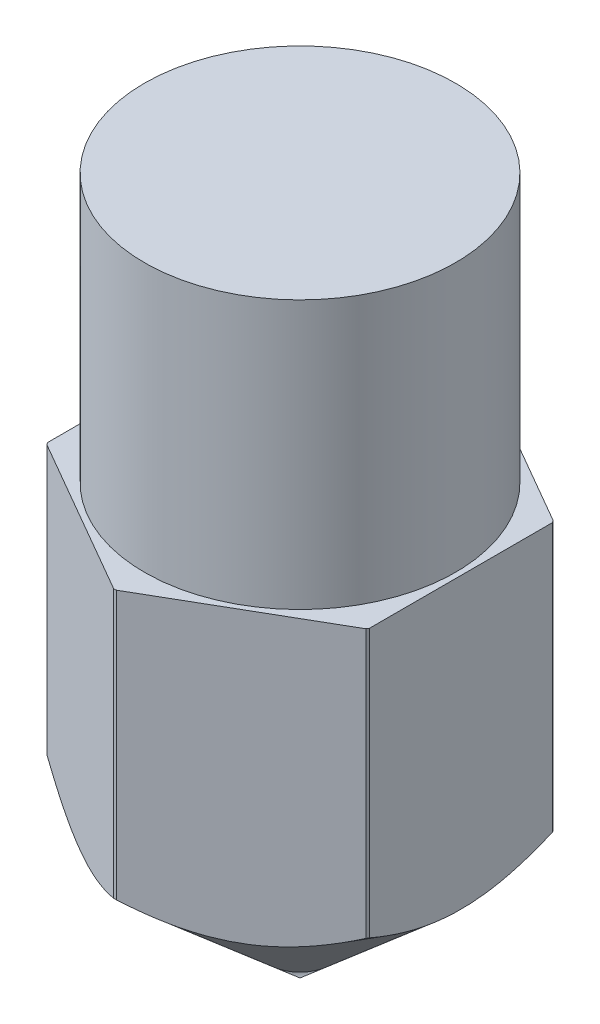
ISO-10303-21;
HEADER;
FILE_DESCRIPTION(('STEP AP214'),'2;1');
FILE_NAME('part.step','',(''),(''),'','','');
FILE_SCHEMA(('AUTOMOTIVE_DESIGN { 1 0 10303 214 1 1 1 1 }'));
ENDSEC;
DATA;
#1=APPLICATION_CONTEXT('core data for automotive mechanical design processes');
#2=APPLICATION_PROTOCOL_DEFINITION('international standard','automotive_design',2000,#1);
#3=PRODUCT_CONTEXT('',#1,'mechanical');
#4=PRODUCT('Part','Part','',(#3));
#5=PRODUCT_RELATED_PRODUCT_CATEGORY('part','',(#4));
#6=PRODUCT_DEFINITION_FORMATION('','',#4);
#7=PRODUCT_DEFINITION_CONTEXT('part definition',#1,'design');
#8=PRODUCT_DEFINITION('design','',#6,#7);
#9=PRODUCT_DEFINITION_SHAPE('','',#8);
#10=(LENGTH_UNIT() NAMED_UNIT(*) SI_UNIT(.MILLI.,.METRE.));
#11=(NAMED_UNIT(*) PLANE_ANGLE_UNIT() SI_UNIT($,.RADIAN.));
#12=(NAMED_UNIT(*) SI_UNIT($,.STERADIAN.) SOLID_ANGLE_UNIT());
#13=UNCERTAINTY_MEASURE_WITH_UNIT(LENGTH_MEASURE(1.E-05),#10,'distance_accuracy_value','');
#14=(GEOMETRIC_REPRESENTATION_CONTEXT(3) GLOBAL_UNCERTAINTY_ASSIGNED_CONTEXT((#13)) GLOBAL_UNIT_ASSIGNED_CONTEXT((#10,
#11,#12)) REPRESENTATION_CONTEXT('',''));
#15=CARTESIAN_POINT('',(0.,0.,0.));
#16=DIRECTION('',(0.,0.,1.));
#17=DIRECTION('',(1.,0.,0.));
#18=AXIS2_PLACEMENT_3D('',#15,#16,#17);
#19=CARTESIAN_POINT('',(0.,-13.,0.));
#20=DIRECTION('',(0.,1.,0.));
#21=DIRECTION('',(-1.,0.,0.));
#22=AXIS2_PLACEMENT_3D('',#19,#20,#21);
#23=CONICAL_SURFACE('',#22,0.,0.855052737126017);
#24=CARTESIAN_POINT('',(0.,-13.,0.));
#25=VERTEX_POINT('',#24);
#26=VERTEX_LOOP('',#25);
#27=FACE_BOUND('',#26,.T.);
#28=CARTESIAN_POINT('',(2.97582698500776,-9.99979999999965,-1.74600710428177));
#29=CARTESIAN_POINT('',(2.8606843641568,-10.056873003555,-1.81248472742527));
#30=CARTESIAN_POINT('',(2.74377777784905,-10.1098350378683,-1.87998077650009));
#31=CARTESIAN_POINT('',(2.50603433844776,-10.2047196229342,-2.0172420152365));
#32=CARTESIAN_POINT('',(2.38518081891569,-10.2465859126824,-2.08701682727085));
#33=CARTESIAN_POINT('',(2.14240753319206,-10.315233555168,-2.22718204913544));
#34=CARTESIAN_POINT('',(2.02054230392454,-10.3422631407693,-2.2975409720579));
#35=CARTESIAN_POINT('',(1.77510943904683,-10.3795345895943,-2.43924170266302));
#36=CARTESIAN_POINT('',(1.65154617808734,-10.3898135490278,-2.51058098463993));
#37=CARTESIAN_POINT('',(1.42065834771779,-10.3923164897,-2.6438841356564));
#38=CARTESIAN_POINT('',(1.31334848159069,-10.3867495257824,-2.70583951575159));
#39=CARTESIAN_POINT('',(1.09976337333825,-10.362685630033,-2.82915293549603));
#40=CARTESIAN_POINT('',(0.993488968299226,-10.3441789956812,-2.89051049185327));
#41=CARTESIAN_POINT('',(0.782937263145666,-10.2957306481262,-3.01207257550202));
#42=CARTESIAN_POINT('',(0.678660435504027,-10.2657862638618,-3.07227683001116));
#43=CARTESIAN_POINT('',(0.472569218996037,-10.1964233676908,-3.19126364933966));
#44=CARTESIAN_POINT('',(0.370754048546885,-10.1570079075343,-3.25004666540607));
#45=CARTESIAN_POINT('',(0.228722192747571,-10.0959918395221,-3.3320487955853));
#46=CARTESIAN_POINT('',(0.187465297515393,-10.0775328166429,-3.35586847515353));
#47=CARTESIAN_POINT('',(0.105465966879054,-10.0394898179468,-3.40321081076979));
#48=CARTESIAN_POINT('',(0.0647224759850853,-10.019908878748,-3.42673407620515));
#49=CARTESIAN_POINT('',(0.0241730149929438,-9.9998,-3.45014531842446));
#50=B_SPLINE_CURVE_WITH_KNOTS('',3,(#28,#29,#30,#31,#32,#33,#34,#35,#36,#37,#38,#39,#40,#41,#42,
#43,#44,#45,#46,#47,#48,#49),.UNSPECIFIED.,.F.,.F.,(4,2,2,2,2,2,2,2,2,2,4),(0.,
0.434373091967146,0.870908269006301,1.29989799407539,1.72793637399438,2.09933699078706,
2.47101639303157,2.84278264680593,3.21442927110194,3.36769023684121,3.52055436152839),.UNSPECIFIED.);
#51=CARTESIAN_POINT('',(2.97542366796795,-10.,-1.74623995948327));
#52=VERTEX_POINT('',#51);
#53=CARTESIAN_POINT('',(0.0245763320320507,-10.,-3.44991246322336));
#54=VERTEX_POINT('',#53);
#55=EDGE_CURVE('E258',#52,#54,#50,.T.);
#56=ORIENTED_EDGE('',*,*,#55,.F.);
#57=CARTESIAN_POINT('',(0.,-10.,0.));
#58=DIRECTION('',(0.,1.,0.));
#59=DIRECTION('',(-1.,0.,0.));
#60=AXIS2_PLACEMENT_3D('',#57,#58,#59);
#61=CIRCLE('',#60,3.45);
#62=CARTESIAN_POINT('',(3.,-10.,-1.70367250374008));
#63=VERTEX_POINT('',#62);
#64=EDGE_CURVE('E262',#63,#52,#61,.T.);
#65=ORIENTED_EDGE('',*,*,#64,.F.);
#66=CARTESIAN_POINT('',(3.,-8.50880616450568,-4.20427308638562));
#67=CARTESIAN_POINT('',(3.,-8.58794816038584,-4.09243355266203));
#68=CARTESIAN_POINT('',(3.,-8.6664126221812,-3.9801060073593));
#69=CARTESIAN_POINT('',(3.,-8.82161955852323,-3.75422531263634));
#70=CARTESIAN_POINT('',(3.,-8.89836157417197,-3.64067184826285));
#71=CARTESIAN_POINT('',(3.,-9.05050693096265,-3.41095210226605));
#72=CARTESIAN_POINT('',(3.,-9.12588784410657,-3.29477091231523));
#73=CARTESIAN_POINT('',(3.,-9.27390458079382,-3.06068129290418));
#74=CARTESIAN_POINT('',(3.,-9.34654064278752,-2.94277301471989));
#75=CARTESIAN_POINT('',(3.,-9.49305636351739,-2.69694529878853));
#76=CARTESIAN_POINT('',(3.,-9.56669648277142,-2.56888222960662));
#77=CARTESIAN_POINT('',(3.,-9.70880199247375,-2.30984944012048));
#78=CARTESIAN_POINT('',(3.,-9.77726603511995,-2.1788789741635));
#79=CARTESIAN_POINT('',(3.,-9.90700995383824,-1.9140868476562));
#80=CARTESIAN_POINT('',(3.,-9.96831930509321,-1.78027977801205));
#81=CARTESIAN_POINT('',(3.,-10.0817631955177,-1.50887025069402));
#82=CARTESIAN_POINT('',(3.,-10.1339043747502,-1.37127062403263));
#83=CARTESIAN_POINT('',(3.,-10.2167201540331,-1.12049072150806));
#84=CARTESIAN_POINT('',(3.,-10.2496039775731,-1.00804734477717));
#85=CARTESIAN_POINT('',(3.,-10.306060206676,-0.780792520425109));
#86=CARTESIAN_POINT('',(3.,-10.329631973577,-0.665980910948103));
#87=CARTESIAN_POINT('',(3.,-10.3655779167841,-0.436838575415079));
#88=CARTESIAN_POINT('',(3.,-10.3781579320622,-0.322540763241441));
#89=CARTESIAN_POINT('',(3.,-10.3919377853524,-0.0932550672200131));
#90=CARTESIAN_POINT('',(3.,-10.3931388810173,0.0217327389605881));
#91=CARTESIAN_POINT('',(3.,-10.3843322311068,0.244678229057442));
#92=CARTESIAN_POINT('',(3.,-10.3749611547034,0.352662116434098));
#93=CARTESIAN_POINT('',(3.,-10.3466654374196,0.567376562358199));
#94=CARTESIAN_POINT('',(3.,-10.327738291009,0.674106784690343));
#95=CARTESIAN_POINT('',(3.,-10.2810049098009,0.887727505782129));
#96=CARTESIAN_POINT('',(3.,-10.2530349046591,0.994581606673847));
#97=CARTESIAN_POINT('',(3.,-10.1897227806305,1.20602990112995));
#98=CARTESIAN_POINT('',(3.,-10.1543817657773,1.31062443054789));
#99=CARTESIAN_POINT('',(3.,-10.059059233376,1.56774748787341));
#100=CARTESIAN_POINT('',(3.,-9.99544029275498,1.71892003226438));
#101=CARTESIAN_POINT('',(3.,-9.85851286564258,2.0168492192344));
#102=CARTESIAN_POINT('',(3.,-9.78519703958335,2.16360241247353));
#103=CARTESIAN_POINT('',(3.,-9.63121634208498,2.45396491475403));
#104=CARTESIAN_POINT('',(3.,-9.55052159569878,2.59755823390073));
#105=CARTESIAN_POINT('',(3.,-9.38394910977586,2.88162544871116));
#106=CARTESIAN_POINT('',(3.,-9.2980728638558,3.02210022750289));
#107=CARTESIAN_POINT('',(3.,-9.12898040255865,3.29017325484228));
#108=CARTESIAN_POINT('',(3.,-9.04604475534989,3.41794945826054));
#109=CARTESIAN_POINT('',(3.,-8.87756022368648,3.67177811184209));
#110=CARTESIAN_POINT('',(3.,-8.79201111193149,3.79783041068443));
#111=CARTESIAN_POINT('',(3.,-8.61970920435081,4.04727506438435));
#112=CARTESIAN_POINT('',(3.,-8.53297656936191,4.1706813900474));
#113=CARTESIAN_POINT('',(3.,-8.35788908863911,4.41629680008578));
#114=CARTESIAN_POINT('',(3.,-8.26953461553244,4.53850614981828));
#115=CARTESIAN_POINT('',(3.,-8.18054644696871,4.66024492887926));
#116=B_SPLINE_CURVE_WITH_KNOTS('',3,(#66,#67,#68,#69,#70,#71,#72,#73,#74,#75,#76,#77,#78,#79,
#80,#81,#82,#83,#84,#85,#86,#87,#88,#89,#90,#91,#92,#93,#94,#95,#96,#97,#98,#99,#100,#101,#102,
#103,#104,#105,#106,#107,#108,#109,#110,#111,#112,#113,#114,#115),.UNSPECIFIED.,.F.,.F.,(4,2,2,
2,2,2,2,2,2,2,2,2,2,2,2,2,2,2,2,2,2,2,2,2,4),(0.,0.411035638192859,0.822179515821306,
1.23762800663316,1.6530403232949,2.09612803666764,2.5393307313906,2.98063778796532,
3.42162389878687,3.77275877806019,4.12391773553547,4.46835031358562,4.81274482284936,
5.13745697374082,5.46225430597881,5.79329847111396,6.1242930878484,6.61582457465689,
7.10773025355811,7.60172402836889,8.09557607883956,8.55253372629521,9.0095312304211,
9.46202661947464,9.91441931491114),.UNSPECIFIED.);
#117=CARTESIAN_POINT('',(3.,-10.,1.70367250374009));
#118=VERTEX_POINT('',#117);
#119=EDGE_CURVE('E305',#118,#63,#116,.F.);
#120=ORIENTED_EDGE('',*,*,#119,.F.);
#121=CARTESIAN_POINT('',(2.97542366796795,-10.,1.74623995948327));
#122=VERTEX_POINT('',#121);
#123=EDGE_CURVE('E181',#122,#118,#61,.T.);
#124=ORIENTED_EDGE('',*,*,#123,.F.);
#125=CARTESIAN_POINT('',(0.0241730149929436,-9.9998,3.45014531842445));
#126=CARTESIAN_POINT('',(0.139315635843858,-10.0568730035553,3.38366769528098));
#127=CARTESIAN_POINT('',(0.256222222151568,-10.1098350378686,3.31617164620618));
#128=CARTESIAN_POINT('',(0.493965661552768,-10.2047196229344,3.17891040746983));
#129=CARTESIAN_POINT('',(0.614819181084786,-10.2465859126826,3.10913559543551));
#130=CARTESIAN_POINT('',(0.85759246680832,-10.3152335551681,2.96897037357098));
#131=CARTESIAN_POINT('',(0.979457696075798,-10.3422631407694,2.89861145064854));
#132=CARTESIAN_POINT('',(1.2248905609534,-10.3795345895944,2.75691072004348));
#133=CARTESIAN_POINT('',(1.34845382191284,-10.3898135490278,2.6855714380666));
#134=CARTESIAN_POINT('',(1.57934165228231,-10.3923164897,2.55226828705017));
#135=CARTESIAN_POINT('',(1.68665151840939,-10.3867495257824,2.490312906955));
#136=CARTESIAN_POINT('',(1.90023662666178,-10.362685630033,2.36699948721059));
#137=CARTESIAN_POINT('',(2.00651103170078,-10.3441789956812,2.30564193085335));
#138=CARTESIAN_POINT('',(2.2170627368543,-10.2957306481263,2.18407984720464));
#139=CARTESIAN_POINT('',(2.32133956449591,-10.2657862638618,2.12387559269551));
#140=CARTESIAN_POINT('',(2.52743078100386,-10.1964233676908,2.00488877336703));
#141=CARTESIAN_POINT('',(2.62924595145299,-10.1570079075344,1.94610575730064));
#142=CARTESIAN_POINT('',(2.77127780725243,-10.0959918395221,1.86410362712133));
#143=CARTESIAN_POINT('',(2.81253470248475,-10.0775328166429,1.84028394755302));
#144=CARTESIAN_POINT('',(2.89453403312137,-10.0394898179466,1.7929416119366));
#145=CARTESIAN_POINT('',(2.93527752401548,-10.0199088787478,1.76941834650116));
#146=CARTESIAN_POINT('',(2.97582698500776,-9.99979999999966,1.74600710428177));
#147=B_SPLINE_CURVE_WITH_KNOTS('',3,(#125,#126,#127,#128,#129,#130,#131,#132,#133,#134,#135,
#136,#137,#138,#139,#140,#141,#142,#143,#144,#145,#146),.UNSPECIFIED.,.F.,.F.,(4,2,2,2,2,2,2,2,
2,2,4),(0.,0.434373091966962,0.870908269005932,1.29989799407484,1.72793637399365,
2.09933699078625,2.47101639303067,2.84278264680495,3.21442927110089,3.36769023684069,
3.52055436152839),.UNSPECIFIED.);
#148=CARTESIAN_POINT('',(0.0245763320320489,-10.,3.44991246322336));
#149=VERTEX_POINT('',#148);
#150=EDGE_CURVE('E182',#149,#122,#147,.T.);
#151=ORIENTED_EDGE('',*,*,#150,.F.);
#152=CARTESIAN_POINT('',(-0.0245763320320482,-10.,3.44991246322336));
#153=VERTEX_POINT('',#152);
#154=EDGE_CURVE('E196',#153,#149,#61,.T.);
#155=ORIENTED_EDGE('',*,*,#154,.F.);
#156=CARTESIAN_POINT('',(-2.97582698500776,-9.99979999999965,1.74600710428177));
#157=CARTESIAN_POINT('',(-2.8606843641568,-10.056873003555,1.81248472742527));
#158=CARTESIAN_POINT('',(-2.74377777784905,-10.1098350378683,1.87998077650009));
#159=CARTESIAN_POINT('',(-2.50603433844776,-10.2047196229342,2.0172420152365));
#160=CARTESIAN_POINT('',(-2.38518081891569,-10.2465859126824,2.08701682727085));
#161=CARTESIAN_POINT('',(-2.14240753319206,-10.315233555168,2.22718204913543));
#162=CARTESIAN_POINT('',(-2.02054230392453,-10.3422631407693,2.2975409720579));
#163=CARTESIAN_POINT('',(-1.77510943904683,-10.3795345895943,2.43924170266302));
#164=CARTESIAN_POINT('',(-1.65154617808734,-10.3898135490278,2.51058098463993));
#165=CARTESIAN_POINT('',(-1.42065834771779,-10.3923164897,2.6438841356564));
#166=CARTESIAN_POINT('',(-1.31334848159068,-10.3867495257824,2.70583951575159));
#167=CARTESIAN_POINT('',(-1.09976337333825,-10.362685630033,2.82915293549603));
#168=CARTESIAN_POINT('',(-0.993488968299221,-10.3441789956812,2.89051049185327));
#169=CARTESIAN_POINT('',(-0.782937263145661,-10.2957306481262,3.01207257550202));
#170=CARTESIAN_POINT('',(-0.678660435504023,-10.2657862638618,3.07227683001116));
#171=CARTESIAN_POINT('',(-0.472569218996033,-10.1964233676908,3.19126364933966));
#172=CARTESIAN_POINT('',(-0.370754048546881,-10.1570079075343,3.25004666540607));
#173=CARTESIAN_POINT('',(-0.228722192747567,-10.0959918395221,3.3320487955853));
#174=CARTESIAN_POINT('',(-0.187465297515389,-10.0775328166429,3.35586847515353));
#175=CARTESIAN_POINT('',(-0.10546596687905,-10.0394898179468,3.40321081076979));
#176=CARTESIAN_POINT('',(-0.0647224759850819,-10.019908878748,3.42673407620515));
#177=CARTESIAN_POINT('',(-0.0241730149929401,-9.9998,3.45014531842446));
#178=B_SPLINE_CURVE_WITH_KNOTS('',3,(#156,#157,#158,#159,#160,#161,#162,#163,#164,#165,#166,
#167,#168,#169,#170,#171,#172,#173,#174,#175,#176,#177),.UNSPECIFIED.,.F.,.F.,(4,2,2,2,2,2,2,2,
2,2,4),(0.,0.434373091967145,0.8709082690063,1.29989799407539,1.72793637399438,2.09933699078707,
2.47101639303157,2.84278264680594,3.21442927110194,3.36769023684121,3.52055436152839),.UNSPECIFIED.);
#179=CARTESIAN_POINT('',(-2.97542366796795,-10.,1.74623995948327));
#180=VERTEX_POINT('',#179);
#181=EDGE_CURVE('E200',#180,#153,#178,.T.);
#182=ORIENTED_EDGE('',*,*,#181,.F.);
#183=CARTESIAN_POINT('',(-3.,-10.,1.70367250374008));
#184=VERTEX_POINT('',#183);
#185=EDGE_CURVE('E149',#184,#180,#61,.T.);
#186=ORIENTED_EDGE('',*,*,#185,.F.);
#187=CARTESIAN_POINT('',(-3.,-8.50880616450569,-4.20427308638561));
#188=CARTESIAN_POINT('',(-3.,-8.58794816038584,-4.09243355266203));
#189=CARTESIAN_POINT('',(-3.,-8.6664126221812,-3.98010600735929));
#190=CARTESIAN_POINT('',(-3.,-8.82161955852324,-3.75422531263634));
#191=CARTESIAN_POINT('',(-3.,-8.89836157417198,-3.64067184826285));
#192=CARTESIAN_POINT('',(-3.,-9.05050693096265,-3.41095210226605));
#193=CARTESIAN_POINT('',(-3.,-9.12588784410658,-3.29477091231523));
#194=CARTESIAN_POINT('',(-3.,-9.27390458079382,-3.06068129290417));
#195=CARTESIAN_POINT('',(-3.,-9.34654064278752,-2.94277301471989));
#196=CARTESIAN_POINT('',(-3.,-9.4930563635174,-2.69694529878853));
#197=CARTESIAN_POINT('',(-3.,-9.56669648277142,-2.56888222960662));
#198=CARTESIAN_POINT('',(-3.,-9.70880199247375,-2.30984944012047));
#199=CARTESIAN_POINT('',(-3.,-9.77726603511995,-2.1788789741635));
#200=CARTESIAN_POINT('',(-3.,-9.90700995383824,-1.9140868476562));
#201=CARTESIAN_POINT('',(-3.,-9.96831930509321,-1.78027977801205));
#202=CARTESIAN_POINT('',(-3.,-10.0817631955177,-1.50887025069402));
#203=CARTESIAN_POINT('',(-3.,-10.1339043747502,-1.37127062403263));
#204=CARTESIAN_POINT('',(-3.,-10.2167201540331,-1.12049072150806));
#205=CARTESIAN_POINT('',(-3.,-10.2496039775731,-1.00804734477717));
#206=CARTESIAN_POINT('',(-3.,-10.306060206676,-0.78079252042511));
#207=CARTESIAN_POINT('',(-3.,-10.329631973577,-0.665980910948104));
#208=CARTESIAN_POINT('',(-3.,-10.3655779167841,-0.43683857541508));
#209=CARTESIAN_POINT('',(-3.,-10.3781579320622,-0.322540763241442));
#210=CARTESIAN_POINT('',(-3.,-10.3919377853524,-0.0932550672200138));
#211=CARTESIAN_POINT('',(-3.,-10.3931388810173,0.0217327389605876));
#212=CARTESIAN_POINT('',(-3.,-10.3843322311068,0.244678229057441));
#213=CARTESIAN_POINT('',(-3.,-10.3749611547034,0.352662116434097));
#214=CARTESIAN_POINT('',(-3.,-10.3466654374196,0.567376562358198));
#215=CARTESIAN_POINT('',(-3.,-10.327738291009,0.674106784690343));
#216=CARTESIAN_POINT('',(-3.,-10.2810049098009,0.887727505782129));
#217=CARTESIAN_POINT('',(-3.,-10.2530349046591,0.994581606673847));
#218=CARTESIAN_POINT('',(-3.,-10.1897227806305,1.20602990112995));
#219=CARTESIAN_POINT('',(-3.,-10.1543817657773,1.31062443054789));
#220=CARTESIAN_POINT('',(-3.,-10.059059233376,1.56774748787341));
#221=CARTESIAN_POINT('',(-3.,-9.99544029275498,1.71892003226438));
#222=CARTESIAN_POINT('',(-3.,-9.85851286564258,2.01684921923441));
#223=CARTESIAN_POINT('',(-3.,-9.78519703958335,2.16360241247354));
#224=CARTESIAN_POINT('',(-3.,-9.63121634208498,2.45396491475403));
#225=CARTESIAN_POINT('',(-3.,-9.55052159569877,2.59755823390073));
#226=CARTESIAN_POINT('',(-3.,-9.38394910977586,2.88162544871116));
#227=CARTESIAN_POINT('',(-3.,-9.2980728638558,3.02210022750289));
#228=CARTESIAN_POINT('',(-3.,-9.12898040255865,3.29017325484228));
#229=CARTESIAN_POINT('',(-3.,-9.04604475534989,3.41794945826054));
#230=CARTESIAN_POINT('',(-3.,-8.87756022368648,3.67177811184209));
#231=CARTESIAN_POINT('',(-3.,-8.79201111193149,3.79783041068443));
#232=CARTESIAN_POINT('',(-3.,-8.61970920435081,4.04727506438435));
#233=CARTESIAN_POINT('',(-3.,-8.5329765693619,4.1706813900474));
#234=CARTESIAN_POINT('',(-3.,-8.3578890886391,4.41629680008578));
#235=CARTESIAN_POINT('',(-3.,-8.26953461553244,4.53850614981828));
#236=CARTESIAN_POINT('',(-3.,-8.18054644696871,4.66024492887926));
#237=B_SPLINE_CURVE_WITH_KNOTS('',3,(#187,#188,#189,#190,#191,#192,#193,#194,#195,#196,#197,
#198,#199,#200,#201,#202,#203,#204,#205,#206,#207,#208,#209,#210,#211,#212,#213,#214,#215,#216,
#217,#218,#219,#220,#221,#222,#223,#224,#225,#226,#227,#228,#229,#230,#231,#232,#233,#234,#235,
#236),.UNSPECIFIED.,.F.,.F.,(4,2,2,2,2,2,2,2,2,2,2,2,2,2,2,2,2,2,2,2,2,2,2,2,4),(0.,
0.411035638192857,0.822179515821302,1.23762800663315,1.6530403232949,2.09612803666763,
2.5393307313906,2.98063778796531,3.42162389878686,3.77275877806018,4.12391773553546,
4.46835031358561,4.81274482284935,5.13745697374081,5.4622543059788,5.79329847111395,
6.12429308784839,6.61582457465688,7.1077302535581,7.60172402836888,8.09557607883956,
8.55253372629521,9.0095312304211,9.46202661947464,9.91441931491114),.UNSPECIFIED.);
#238=CARTESIAN_POINT('',(-3.,-10.,-1.70367250374008));
#239=VERTEX_POINT('',#238);
#240=EDGE_CURVE('E236',#239,#184,#237,.T.);
#241=ORIENTED_EDGE('',*,*,#240,.F.);
#242=CARTESIAN_POINT('',(-2.97542366796795,-10.,-1.74623995948327));
#243=VERTEX_POINT('',#242);
#244=EDGE_CURVE('E256',#243,#239,#61,.T.);
#245=ORIENTED_EDGE('',*,*,#244,.F.);
#246=CARTESIAN_POINT('',(-0.0241730149929403,-9.9998,-3.45014531842445));
#247=CARTESIAN_POINT('',(-0.139315635843855,-10.0568730035553,-3.38366769528098));
#248=CARTESIAN_POINT('',(-0.256222222151565,-10.1098350378686,-3.31617164620618));
#249=CARTESIAN_POINT('',(-0.493965661552766,-10.2047196229344,-3.17891040746983));
#250=CARTESIAN_POINT('',(-0.614819181084783,-10.2465859126826,-3.10913559543551));
#251=CARTESIAN_POINT('',(-0.857592466808317,-10.3152335551681,-2.96897037357098));
#252=CARTESIAN_POINT('',(-0.979457696075795,-10.3422631407694,-2.89861145064854));
#253=CARTESIAN_POINT('',(-1.2248905609534,-10.3795345895944,-2.75691072004348));
#254=CARTESIAN_POINT('',(-1.34845382191284,-10.3898135490278,-2.6855714380666));
#255=CARTESIAN_POINT('',(-1.57934165228231,-10.3923164897,-2.55226828705017));
#256=CARTESIAN_POINT('',(-1.68665151840939,-10.3867495257824,-2.490312906955));
#257=CARTESIAN_POINT('',(-1.90023662666178,-10.362685630033,-2.36699948721059));
#258=CARTESIAN_POINT('',(-2.00651103170078,-10.3441789956812,-2.30564193085335));
#259=CARTESIAN_POINT('',(-2.21706273685429,-10.2957306481263,-2.18407984720464));
#260=CARTESIAN_POINT('',(-2.32133956449591,-10.2657862638618,-2.12387559269551));
#261=CARTESIAN_POINT('',(-2.52743078100386,-10.1964233676908,-2.00488877336703));
#262=CARTESIAN_POINT('',(-2.62924595145299,-10.1570079075344,-1.94610575730064));
#263=CARTESIAN_POINT('',(-2.77127780725243,-10.0959918395221,-1.86410362712133));
#264=CARTESIAN_POINT('',(-2.81253470248475,-10.0775328166429,-1.84028394755302));
#265=CARTESIAN_POINT('',(-2.89453403312137,-10.0394898179466,-1.7929416119366));
#266=CARTESIAN_POINT('',(-2.93527752401548,-10.0199088787478,-1.76941834650116));
#267=CARTESIAN_POINT('',(-2.97582698500776,-9.99979999999966,-1.74600710428177));
#268=B_SPLINE_CURVE_WITH_KNOTS('',3,(#246,#247,#248,#249,#250,#251,#252,#253,#254,#255,#256,
#257,#258,#259,#260,#261,#262,#263,#264,#265,#266,#267),.UNSPECIFIED.,.F.,.F.,(4,2,2,2,2,2,2,2,
2,2,4),(0.,0.434373091966963,0.870908269005932,1.29989799407484,1.72793637399365,
2.09933699078625,2.47101639303067,2.84278264680495,3.21442927110089,3.36769023684069,
3.52055436152839),.UNSPECIFIED.);
#269=CARTESIAN_POINT('',(-0.0245763320320464,-10.,-3.44991246322336));
#270=VERTEX_POINT('',#269);
#271=EDGE_CURVE('E295',#270,#243,#268,.T.);
#272=ORIENTED_EDGE('',*,*,#271,.F.);
#273=EDGE_CURVE('E141',#54,#270,#61,.T.);
#274=ORIENTED_EDGE('',*,*,#273,.F.);
#275=EDGE_LOOP('',(#56,#65,#120,#124,#151,#155,#182,#186,#241,#245,#272,#274));
#276=FACE_BOUND('',#275,.T.);
#277=ADVANCED_FACE('F35',(#27,#276),#23,.T.);
#278=CARTESIAN_POINT('',(0.,0.,0.));
#279=DIRECTION('',(0.,1.,0.));
#280=DIRECTION('',(-1.,0.,0.));
#281=AXIS2_PLACEMENT_3D('',#278,#279,#280);
#282=CYLINDRICAL_SURFACE('',#281,3.45);
#283=DIRECTION('',(0.,1.,0.));
#284=VECTOR('',#283,1.);
#285=CARTESIAN_POINT('',(0.0245763320320487,0.,-3.44991246322336));
#286=LINE('',#285,#284);
#287=CARTESIAN_POINT('',(0.0245763320320513,-5.,-3.44991246322336));
#288=VERTEX_POINT('',#287);
#289=EDGE_CURVE('E57',#54,#288,#286,.T.);
#290=ORIENTED_EDGE('',*,*,#289,.F.);
#291=ORIENTED_EDGE('',*,*,#273,.T.);
#292=DIRECTION('',(0.,1.,0.));
#293=VECTOR('',#292,1.);
#294=CARTESIAN_POINT('',(-0.0245763320320485,0.,-3.44991246322336));
#295=LINE('',#294,#293);
#296=CARTESIAN_POINT('',(-0.0245763320320478,-5.,-3.44991246322336));
#297=VERTEX_POINT('',#296);
#298=EDGE_CURVE('E126',#297,#270,#295,.F.);
#299=ORIENTED_EDGE('',*,*,#298,.F.);
#300=CARTESIAN_POINT('',(0.,-5.,0.));
#301=DIRECTION('',(0.,1.,0.));
#302=DIRECTION('',(-1.,0.,0.));
#303=AXIS2_PLACEMENT_3D('',#300,#301,#302);
#304=CIRCLE('',#303,3.45);
#305=EDGE_CURVE('E139',#288,#297,#304,.T.);
#306=ORIENTED_EDGE('',*,*,#305,.F.);
#307=EDGE_LOOP('',(#290,#291,#299,#306));
#308=FACE_BOUND('',#307,.T.);
#309=ADVANCED_FACE('F138',(#308),#282,.T.);
#310=DIRECTION('',(0.,1.,0.));
#311=VECTOR('',#310,1.);
#312=CARTESIAN_POINT('',(2.97542366796795,0.,-1.74623995948327));
#313=LINE('',#312,#311);
#314=CARTESIAN_POINT('',(2.97542366796795,-5.,-1.74623995948328));
#315=VERTEX_POINT('',#314);
#316=EDGE_CURVE('E263',#315,#52,#313,.F.);
#317=ORIENTED_EDGE('',*,*,#316,.F.);
#318=CARTESIAN_POINT('',(3.,-5.,-1.70367250374008));
#319=VERTEX_POINT('',#318);
#320=EDGE_CURVE('E145',#319,#315,#304,.T.);
#321=ORIENTED_EDGE('',*,*,#320,.F.);
#322=DIRECTION('',(0.,1.,0.));
#323=VECTOR('',#322,1.);
#324=CARTESIAN_POINT('',(3.,0.,-1.70367250374008));
#325=LINE('',#324,#323);
#326=EDGE_CURVE('E172',#63,#319,#325,.T.);
#327=ORIENTED_EDGE('',*,*,#326,.F.);
#328=ORIENTED_EDGE('',*,*,#64,.T.);
#329=EDGE_LOOP('',(#317,#321,#327,#328));
#330=FACE_BOUND('',#329,.T.);
#331=ADVANCED_FACE('F280',(#330),#282,.T.);
#332=DIRECTION('',(0.,1.,0.));
#333=VECTOR('',#332,1.);
#334=CARTESIAN_POINT('',(3.,0.,1.70367250374009));
#335=LINE('',#334,#333);
#336=CARTESIAN_POINT('',(3.,-5.,1.70367250374008));
#337=VERTEX_POINT('',#336);
#338=EDGE_CURVE('E169',#337,#118,#335,.F.);
#339=ORIENTED_EDGE('',*,*,#338,.F.);
#340=CARTESIAN_POINT('',(2.97542366796795,-5.,1.74623995948327));
#341=VERTEX_POINT('',#340);
#342=EDGE_CURVE('E148',#341,#337,#304,.T.);
#343=ORIENTED_EDGE('',*,*,#342,.F.);
#344=DIRECTION('',(0.,1.,0.));
#345=VECTOR('',#344,1.);
#346=CARTESIAN_POINT('',(2.97542366796795,0.,1.74623995948327));
#347=LINE('',#346,#345);
#348=EDGE_CURVE('E199',#122,#341,#347,.T.);
#349=ORIENTED_EDGE('',*,*,#348,.F.);
#350=ORIENTED_EDGE('',*,*,#123,.T.);
#351=EDGE_LOOP('',(#339,#343,#349,#350));
#352=FACE_BOUND('',#351,.T.);
#353=ADVANCED_FACE('F178',(#352),#282,.T.);
#354=DIRECTION('',(0.,1.,0.));
#355=VECTOR('',#354,1.);
#356=CARTESIAN_POINT('',(0.0245763320320469,0.,3.44991246322336));
#357=LINE('',#356,#355);
#358=CARTESIAN_POINT('',(0.0245763320320498,-5.,3.44991246322336));
#359=VERTEX_POINT('',#358);
#360=EDGE_CURVE('E195',#359,#149,#357,.F.);
#361=ORIENTED_EDGE('',*,*,#360,.F.);
#362=CARTESIAN_POINT('',(-0.0245763320320485,-5.,3.44991246322336));
#363=VERTEX_POINT('',#362);
#364=EDGE_CURVE('E155',#363,#359,#304,.T.);
#365=ORIENTED_EDGE('',*,*,#364,.F.);
#366=DIRECTION('',(0.,1.,0.));
#367=VECTOR('',#366,1.);
#368=CARTESIAN_POINT('',(-0.0245763320320502,0.,3.44991246322336));
#369=LINE('',#368,#367);
#370=EDGE_CURVE('E193',#153,#363,#369,.T.);
#371=ORIENTED_EDGE('',*,*,#370,.F.);
#372=ORIENTED_EDGE('',*,*,#154,.T.);
#373=EDGE_LOOP('',(#361,#365,#371,#372));
#374=FACE_BOUND('',#373,.T.);
#375=ADVANCED_FACE('F191',(#374),#282,.T.);
#376=DIRECTION('',(0.,1.,0.));
#377=VECTOR('',#376,1.);
#378=CARTESIAN_POINT('',(-2.97542366796795,0.,1.74623995948327));
#379=LINE('',#378,#377);
#380=CARTESIAN_POINT('',(-2.97542366796795,-5.,1.74623995948327));
#381=VERTEX_POINT('',#380);
#382=EDGE_CURVE('E242',#381,#180,#379,.F.);
#383=ORIENTED_EDGE('',*,*,#382,.F.);
#384=CARTESIAN_POINT('',(-3.,-5.,1.70367250374008));
#385=VERTEX_POINT('',#384);
#386=EDGE_CURVE('E150',#385,#381,#304,.T.);
#387=ORIENTED_EDGE('',*,*,#386,.F.);
#388=DIRECTION('',(0.,1.,0.));
#389=VECTOR('',#388,1.);
#390=CARTESIAN_POINT('',(-3.,0.,1.70367250374008));
#391=LINE('',#390,#389);
#392=EDGE_CURVE('E243',#184,#385,#391,.T.);
#393=ORIENTED_EDGE('',*,*,#392,.F.);
#394=ORIENTED_EDGE('',*,*,#185,.T.);
#395=EDGE_LOOP('',(#383,#387,#393,#394));
#396=FACE_BOUND('',#395,.T.);
#397=ADVANCED_FACE('F254',(#396),#282,.T.);
#398=DIRECTION('',(0.,1.,0.));
#399=VECTOR('',#398,1.);
#400=CARTESIAN_POINT('',(-3.,0.,-1.70367250374008));
#401=LINE('',#400,#399);
#402=CARTESIAN_POINT('',(-3.,-5.,-1.70367250374008));
#403=VERTEX_POINT('',#402);
#404=EDGE_CURVE('E294',#403,#239,#401,.F.);
#405=ORIENTED_EDGE('',*,*,#404,.F.);
#406=CARTESIAN_POINT('',(-2.97542366796795,-5.,-1.74623995948327));
#407=VERTEX_POINT('',#406);
#408=EDGE_CURVE('E146',#407,#403,#304,.T.);
#409=ORIENTED_EDGE('',*,*,#408,.F.);
#410=DIRECTION('',(0.,1.,0.));
#411=VECTOR('',#410,1.);
#412=CARTESIAN_POINT('',(-2.97542366796795,0.,-1.74623995948327));
#413=LINE('',#412,#411);
#414=EDGE_CURVE('E50',#243,#407,#413,.T.);
#415=ORIENTED_EDGE('',*,*,#414,.F.);
#416=ORIENTED_EDGE('',*,*,#244,.T.);
#417=EDGE_LOOP('',(#405,#409,#415,#416));
#418=FACE_BOUND('',#417,.T.);
#419=ADVANCED_FACE('F281',(#418),#282,.T.);
#420=CARTESIAN_POINT('',(0.,-5.,0.));
#421=DIRECTION('',(0.,-1.,0.));
#422=DIRECTION('',(1.,0.,0.));
#423=AXIS2_PLACEMENT_3D('',#420,#421,#422);
#424=PLANE('',#423);
#425=CARTESIAN_POINT('',(0.,-5.,0.));
#426=DIRECTION('',(0.,1.,0.));
#427=DIRECTION('',(-1.,0.,0.));
#428=AXIS2_PLACEMENT_3D('',#425,#426,#427);
#429=CIRCLE('',#428,2.9);
#430=CARTESIAN_POINT('',(-2.9,-5.,0.));
#431=VERTEX_POINT('',#430);
#432=EDGE_CURVE('E154',#431,#431,#429,.T.);
#433=ORIENTED_EDGE('',*,*,#432,.F.);
#434=EDGE_LOOP('',(#433));
#435=FACE_BOUND('',#434,.T.);
#436=DIRECTION('',(0.866025403784439,0.,0.5));
#437=VECTOR('',#436,1.);
#438=CARTESIAN_POINT('',(1.5,-5.,-2.59807621135332));
#439=LINE('',#438,#437);
#440=EDGE_CURVE('E12',#288,#315,#439,.T.);
#441=ORIENTED_EDGE('',*,*,#440,.F.);
#442=ORIENTED_EDGE('',*,*,#305,.T.);
#443=DIRECTION('',(0.866025403784439,0.,-0.5));
#444=VECTOR('',#443,1.);
#445=CARTESIAN_POINT('',(-1.5,-5.,-2.59807621135332));
#446=LINE('',#445,#444);
#447=EDGE_CURVE('E123',#407,#297,#446,.T.);
#448=ORIENTED_EDGE('',*,*,#447,.F.);
#449=ORIENTED_EDGE('',*,*,#408,.T.);
#450=DIRECTION('',(0.,0.,-1.));
#451=VECTOR('',#450,1.);
#452=CARTESIAN_POINT('',(-3.,-5.,0.));
#453=LINE('',#452,#451);
#454=EDGE_CURVE('E132',#385,#403,#453,.T.);
#455=ORIENTED_EDGE('',*,*,#454,.F.);
#456=ORIENTED_EDGE('',*,*,#386,.T.);
#457=DIRECTION('',(-0.866025403784439,0.,-0.5));
#458=VECTOR('',#457,1.);
#459=CARTESIAN_POINT('',(-1.5,-5.,2.59807621135332));
#460=LINE('',#459,#458);
#461=EDGE_CURVE('E162',#363,#381,#460,.T.);
#462=ORIENTED_EDGE('',*,*,#461,.F.);
#463=ORIENTED_EDGE('',*,*,#364,.T.);
#464=DIRECTION('',(-0.866025403784439,0.,0.5));
#465=VECTOR('',#464,1.);
#466=CARTESIAN_POINT('',(1.5,-5.,2.59807621135332));
#467=LINE('',#466,#465);
#468=EDGE_CURVE('E164',#341,#359,#467,.T.);
#469=ORIENTED_EDGE('',*,*,#468,.F.);
#470=ORIENTED_EDGE('',*,*,#342,.T.);
#471=DIRECTION('',(0.,0.,1.));
#472=VECTOR('',#471,1.);
#473=CARTESIAN_POINT('',(3.,-5.,0.));
#474=LINE('',#473,#472);
#475=EDGE_CURVE('E43',#319,#337,#474,.T.);
#476=ORIENTED_EDGE('',*,*,#475,.F.);
#477=ORIENTED_EDGE('',*,*,#320,.T.);
#478=EDGE_LOOP('',(#441,#442,#448,#449,#455,#456,#462,#463,#469,#470,#476,#477));
#479=FACE_BOUND('',#478,.T.);
#480=ADVANCED_FACE('F143',(#435,#479),#424,.F.);
#481=CARTESIAN_POINT('',(0.,0.,0.));
#482=DIRECTION('',(0.,1.,0.));
#483=DIRECTION('',(-1.,0.,0.));
#484=AXIS2_PLACEMENT_3D('',#481,#482,#483);
#485=CYLINDRICAL_SURFACE('',#484,2.9);
#486=CARTESIAN_POINT('',(0.,0.,0.));
#487=DIRECTION('',(0.,1.,0.));
#488=DIRECTION('',(-1.,0.,0.));
#489=AXIS2_PLACEMENT_3D('',#486,#487,#488);
#490=CIRCLE('',#489,2.9);
#491=CARTESIAN_POINT('',(-2.9,0.,0.));
#492=VERTEX_POINT('',#491);
#493=EDGE_CURVE('E133',#492,#492,#490,.T.);
#494=ORIENTED_EDGE('',*,*,#493,.F.);
#495=EDGE_LOOP('',(#494));
#496=FACE_BOUND('',#495,.T.);
#497=ORIENTED_EDGE('',*,*,#432,.T.);
#498=EDGE_LOOP('',(#497));
#499=FACE_BOUND('',#498,.T.);
#500=ADVANCED_FACE('F292',(#496,#499),#485,.T.);
#501=CARTESIAN_POINT('',(0.,0.,0.));
#502=DIRECTION('',(0.,-1.,0.));
#503=DIRECTION('',(1.,0.,0.));
#504=AXIS2_PLACEMENT_3D('',#501,#502,#503);
#505=PLANE('',#504);
#506=ORIENTED_EDGE('',*,*,#493,.T.);
#507=EDGE_LOOP('',(#506));
#508=FACE_BOUND('',#507,.T.);
#509=ADVANCED_FACE('F37',(#508),#505,.F.);
#510=CARTESIAN_POINT('',(0.,-20.,-3.46410161513775));
#511=DIRECTION('',(-0.5,0.,-0.866025403784439));
#512=DIRECTION('',(-0.866025403784439,0.,0.5));
#513=AXIS2_PLACEMENT_3D('',#510,#511,#512);
#514=PLANE('',#513);
#515=ORIENTED_EDGE('',*,*,#271,.T.);
#516=ORIENTED_EDGE('',*,*,#414,.T.);
#517=ORIENTED_EDGE('',*,*,#447,.T.);
#518=ORIENTED_EDGE('',*,*,#298,.T.);
#519=EDGE_LOOP('',(#515,#516,#517,#518));
#520=FACE_BOUND('',#519,.T.);
#521=ADVANCED_FACE('F125',(#520),#514,.T.);
#522=CARTESIAN_POINT('',(-3.,-20.,-1.73205080756888));
#523=DIRECTION('',(-1.,0.,0.));
#524=DIRECTION('',(0.,-1.,0.));
#525=AXIS2_PLACEMENT_3D('',#522,#523,#524);
#526=PLANE('',#525);
#527=ORIENTED_EDGE('',*,*,#240,.T.);
#528=ORIENTED_EDGE('',*,*,#392,.T.);
#529=ORIENTED_EDGE('',*,*,#454,.T.);
#530=ORIENTED_EDGE('',*,*,#404,.T.);
#531=EDGE_LOOP('',(#527,#528,#529,#530));
#532=FACE_BOUND('',#531,.T.);
#533=ADVANCED_FACE('F228',(#532),#526,.T.);
#534=CARTESIAN_POINT('',(-3.,-20.,1.73205080756888));
#535=DIRECTION('',(-0.5,0.,0.866025403784439));
#536=DIRECTION('',(0.866025403784439,0.,0.5));
#537=AXIS2_PLACEMENT_3D('',#534,#535,#536);
#538=PLANE('',#537);
#539=ORIENTED_EDGE('',*,*,#181,.T.);
#540=ORIENTED_EDGE('',*,*,#370,.T.);
#541=ORIENTED_EDGE('',*,*,#461,.T.);
#542=ORIENTED_EDGE('',*,*,#382,.T.);
#543=EDGE_LOOP('',(#539,#540,#541,#542));
#544=FACE_BOUND('',#543,.T.);
#545=ADVANCED_FACE('F223',(#544),#538,.T.);
#546=CARTESIAN_POINT('',(0.,-20.,3.46410161513775));
#547=DIRECTION('',(0.5,0.,0.866025403784439));
#548=DIRECTION('',(0.866025403784439,0.,-0.5));
#549=AXIS2_PLACEMENT_3D('',#546,#547,#548);
#550=PLANE('',#549);
#551=ORIENTED_EDGE('',*,*,#150,.T.);
#552=ORIENTED_EDGE('',*,*,#348,.T.);
#553=ORIENTED_EDGE('',*,*,#468,.T.);
#554=ORIENTED_EDGE('',*,*,#360,.T.);
#555=EDGE_LOOP('',(#551,#552,#553,#554));
#556=FACE_BOUND('',#555,.T.);
#557=ADVANCED_FACE('F219',(#556),#550,.T.);
#558=CARTESIAN_POINT('',(3.,-20.,1.73205080756888));
#559=DIRECTION('',(1.,0.,0.));
#560=DIRECTION('',(0.,1.,0.));
#561=AXIS2_PLACEMENT_3D('',#558,#559,#560);
#562=PLANE('',#561);
#563=ORIENTED_EDGE('',*,*,#119,.T.);
#564=ORIENTED_EDGE('',*,*,#326,.T.);
#565=ORIENTED_EDGE('',*,*,#475,.T.);
#566=ORIENTED_EDGE('',*,*,#338,.T.);
#567=EDGE_LOOP('',(#563,#564,#565,#566));
#568=FACE_BOUND('',#567,.T.);
#569=ADVANCED_FACE('F168',(#568),#562,.T.);
#570=CARTESIAN_POINT('',(3.,-20.,-1.73205080756888));
#571=DIRECTION('',(0.5,0.,-0.866025403784439));
#572=DIRECTION('',(-0.866025403784439,0.,-0.5));
#573=AXIS2_PLACEMENT_3D('',#570,#571,#572);
#574=PLANE('',#573);
#575=ORIENTED_EDGE('',*,*,#55,.T.);
#576=ORIENTED_EDGE('',*,*,#289,.T.);
#577=ORIENTED_EDGE('',*,*,#440,.T.);
#578=ORIENTED_EDGE('',*,*,#316,.T.);
#579=EDGE_LOOP('',(#575,#576,#577,#578));
#580=FACE_BOUND('',#579,.T.);
#581=ADVANCED_FACE('F269',(#580),#574,.T.);
#582=CLOSED_SHELL('',(#277,#309,#331,#353,#375,#397,#419,#480,#500,#509,#521,#533,#545,#557,
#569,#581));
#583=MANIFOLD_SOLID_BREP('B2',#582);
#584=ADVANCED_BREP_SHAPE_REPRESENTATION('',(#18,#583),#14);
#585=SHAPE_DEFINITION_REPRESENTATION(#9,#584);
ENDSEC;
END-ISO-10303-21;
